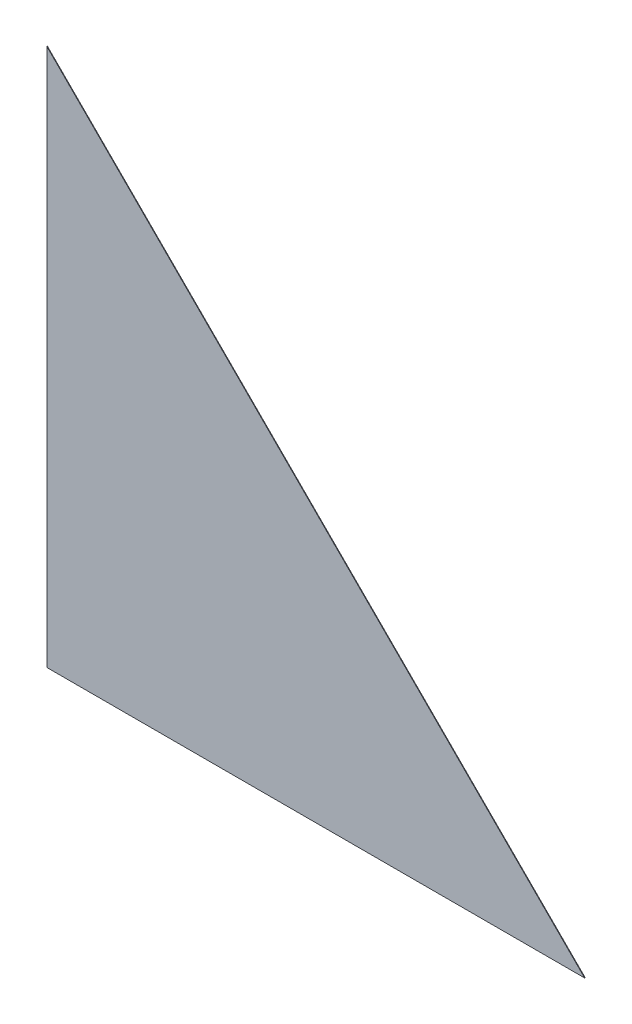
ISO-10303-21;
HEADER;
FILE_DESCRIPTION(('STEP AP214'),'2;1');
FILE_NAME('part.step','',(''),(''),'','','');
FILE_SCHEMA(('AUTOMOTIVE_DESIGN { 1 0 10303 214 1 1 1 1 }'));
ENDSEC;
DATA;
#1=APPLICATION_CONTEXT('core data for automotive mechanical design processes');
#2=APPLICATION_PROTOCOL_DEFINITION('international standard','automotive_design',2000,#1);
#3=PRODUCT_CONTEXT('',#1,'mechanical');
#4=PRODUCT('Part','Part','',(#3));
#5=PRODUCT_RELATED_PRODUCT_CATEGORY('part','',(#4));
#6=PRODUCT_DEFINITION_FORMATION('','',#4);
#7=PRODUCT_DEFINITION_CONTEXT('part definition',#1,'design');
#8=PRODUCT_DEFINITION('design','',#6,#7);
#9=PRODUCT_DEFINITION_SHAPE('','',#8);
#10=(LENGTH_UNIT() NAMED_UNIT(*) SI_UNIT(.MILLI.,.METRE.));
#11=(NAMED_UNIT(*) PLANE_ANGLE_UNIT() SI_UNIT($,.RADIAN.));
#12=(NAMED_UNIT(*) SI_UNIT($,.STERADIAN.) SOLID_ANGLE_UNIT());
#13=UNCERTAINTY_MEASURE_WITH_UNIT(LENGTH_MEASURE(1.E-05),#10,'distance_accuracy_value','');
#14=(GEOMETRIC_REPRESENTATION_CONTEXT(3) GLOBAL_UNCERTAINTY_ASSIGNED_CONTEXT((#13)) GLOBAL_UNIT_ASSIGNED_CONTEXT((#10,
#11,#12)) REPRESENTATION_CONTEXT('',''));
#15=CARTESIAN_POINT('',(0.,0.,0.));
#16=DIRECTION('',(0.,0.,1.));
#17=DIRECTION('',(1.,0.,0.));
#18=AXIS2_PLACEMENT_3D('',#15,#16,#17);
#19=CARTESIAN_POINT('',(0.,-32.9181568006634,1.5875));
#20=DIRECTION('',(0.,-1.,0.));
#21=DIRECTION('',(1.,0.,0.));
#22=AXIS2_PLACEMENT_3D('',#19,#20,#21);
#23=PLANE('',#22);
#24=DIRECTION('',(0.,0.,1.));
#25=VECTOR('',#24,1.);
#26=CARTESIAN_POINT('',(0.,-32.9181568006634,1.5875));
#27=LINE('',#26,#25);
#28=CARTESIAN_POINT('',(0.,-32.9181568006634,0.));
#29=VERTEX_POINT('',#28);
#30=CARTESIAN_POINT('',(0.,-32.9181568006634,1.5875));
#31=VERTEX_POINT('',#30);
#32=EDGE_CURVE('E11',#29,#31,#27,.T.);
#33=ORIENTED_EDGE('',*,*,#32,.F.);
#34=DIRECTION('',(1.,0.,0.));
#35=VECTOR('',#34,1.);
#36=CARTESIAN_POINT('',(0.,-32.9181568006634,0.));
#37=LINE('',#36,#35);
#38=CARTESIAN_POINT('',(1524.,-32.9181568006634,0.));
#39=VERTEX_POINT('',#38);
#40=EDGE_CURVE('E81',#29,#39,#37,.T.);
#41=ORIENTED_EDGE('',*,*,#40,.T.);
#42=DIRECTION('',(0.,0.,1.));
#43=VECTOR('',#42,1.);
#44=CARTESIAN_POINT('',(1524.,-32.9181568006634,1.5875));
#45=LINE('',#44,#43);
#46=CARTESIAN_POINT('',(1524.,-32.9181568006634,1.5875));
#47=VERTEX_POINT('',#46);
#48=EDGE_CURVE('E47',#39,#47,#45,.T.);
#49=ORIENTED_EDGE('',*,*,#48,.T.);
#50=DIRECTION('',(1.,0.,0.));
#51=VECTOR('',#50,1.);
#52=CARTESIAN_POINT('',(0.,-32.9181568006634,1.5875));
#53=LINE('',#52,#51);
#54=EDGE_CURVE('E76',#31,#47,#53,.T.);
#55=ORIENTED_EDGE('',*,*,#54,.F.);
#56=EDGE_LOOP('',(#33,#41,#49,#55));
#57=FACE_BOUND('',#56,.T.);
#58=ADVANCED_FACE('F37',(#57),#23,.T.);
#59=CARTESIAN_POINT('',(1524.,-32.9181568006634,1.5875));
#60=DIRECTION('',(0.707106781186547,0.707106781186548,0.));
#61=DIRECTION('',(-0.707106781186548,0.707106781186547,0.));
#62=AXIS2_PLACEMENT_3D('',#59,#60,#61);
#63=PLANE('',#62);
#64=ORIENTED_EDGE('',*,*,#48,.F.);
#65=DIRECTION('',(-0.707106781186548,0.707106781186547,0.));
#66=VECTOR('',#65,1.);
#67=CARTESIAN_POINT('',(1524.,-32.9181568006634,0.));
#68=LINE('',#67,#66);
#69=CARTESIAN_POINT('',(-1.67972554971051E-13,1491.08184319934,0.));
#70=VERTEX_POINT('',#69);
#71=EDGE_CURVE('E80',#39,#70,#68,.T.);
#72=ORIENTED_EDGE('',*,*,#71,.T.);
#73=DIRECTION('',(0.,0.,1.));
#74=VECTOR('',#73,1.);
#75=CARTESIAN_POINT('',(-1.67972554971051E-13,1491.08184319934,1.5875));
#76=LINE('',#75,#74);
#77=CARTESIAN_POINT('',(-1.67972554971051E-13,1491.08184319934,1.5875));
#78=VERTEX_POINT('',#77);
#79=EDGE_CURVE('E41',#70,#78,#76,.T.);
#80=ORIENTED_EDGE('',*,*,#79,.T.);
#81=DIRECTION('',(-0.707106781186548,0.707106781186547,0.));
#82=VECTOR('',#81,1.);
#83=CARTESIAN_POINT('',(1524.,-32.9181568006634,1.5875));
#84=LINE('',#83,#82);
#85=EDGE_CURVE('E88',#47,#78,#84,.T.);
#86=ORIENTED_EDGE('',*,*,#85,.F.);
#87=EDGE_LOOP('',(#64,#72,#80,#86));
#88=FACE_BOUND('',#87,.T.);
#89=ADVANCED_FACE('F83',(#88),#63,.T.);
#90=CARTESIAN_POINT('',(-1.67972554971051E-13,1491.08184319934,1.5875));
#91=DIRECTION('',(-1.,0.,0.));
#92=DIRECTION('',(0.,-1.,0.));
#93=AXIS2_PLACEMENT_3D('',#90,#91,#92);
#94=PLANE('',#93);
#95=DIRECTION('',(0.,1.,0.));
#96=VECTOR('',#95,1.);
#97=CARTESIAN_POINT('',(-1.67972554971051E-13,0.,0.));
#98=LINE('',#97,#96);
#99=EDGE_CURVE('E69',#70,#29,#98,.F.);
#100=ORIENTED_EDGE('',*,*,#99,.T.);
#101=ORIENTED_EDGE('',*,*,#32,.T.);
#102=DIRECTION('',(0.,-1.,0.));
#103=VECTOR('',#102,1.);
#104=CARTESIAN_POINT('',(-1.67972554971051E-13,1491.08184319934,1.5875));
#105=LINE('',#104,#103);
#106=EDGE_CURVE('E72',#78,#31,#105,.T.);
#107=ORIENTED_EDGE('',*,*,#106,.F.);
#108=ORIENTED_EDGE('',*,*,#79,.F.);
#109=EDGE_LOOP('',(#100,#101,#107,#108));
#110=FACE_BOUND('',#109,.T.);
#111=ADVANCED_FACE('F39',(#110),#94,.T.);
#112=CARTESIAN_POINT('',(0.,0.,1.5875));
#113=DIRECTION('',(0.,0.,1.));
#114=DIRECTION('',(1.,0.,0.));
#115=AXIS2_PLACEMENT_3D('',#112,#113,#114);
#116=PLANE('',#115);
#117=ORIENTED_EDGE('',*,*,#85,.T.);
#118=ORIENTED_EDGE('',*,*,#106,.T.);
#119=ORIENTED_EDGE('',*,*,#54,.T.);
#120=EDGE_LOOP('',(#117,#118,#119));
#121=FACE_BOUND('',#120,.T.);
#122=ADVANCED_FACE('F93',(#121),#116,.T.);
#123=CARTESIAN_POINT('',(0.,0.,0.));
#124=DIRECTION('',(0.,0.,1.));
#125=DIRECTION('',(1.,0.,0.));
#126=AXIS2_PLACEMENT_3D('',#123,#124,#125);
#127=PLANE('',#126);
#128=ORIENTED_EDGE('',*,*,#71,.F.);
#129=ORIENTED_EDGE('',*,*,#40,.F.);
#130=ORIENTED_EDGE('',*,*,#99,.F.);
#131=EDGE_LOOP('',(#128,#129,#130));
#132=FACE_BOUND('',#131,.T.);
#133=ADVANCED_FACE('F79',(#132),#127,.F.);
#134=CLOSED_SHELL('',(#58,#89,#111,#122,#133));
#135=MANIFOLD_SOLID_BREP('B2',#134);
#136=ADVANCED_BREP_SHAPE_REPRESENTATION('',(#18,#135),#14);
#137=SHAPE_DEFINITION_REPRESENTATION(#9,#136);
ENDSEC;
END-ISO-10303-21;
